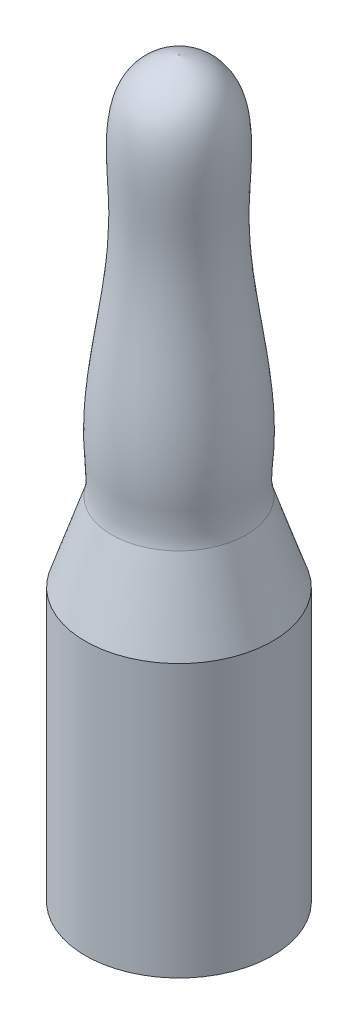
ISO-10303-21;
HEADER;
FILE_DESCRIPTION(('STEP AP214'),'2;1');
FILE_NAME('part.step','',(''),(''),'','','');
FILE_SCHEMA(('AUTOMOTIVE_DESIGN { 1 0 10303 214 1 1 1 1 }'));
ENDSEC;
DATA;
#1=APPLICATION_CONTEXT('core data for automotive mechanical design processes');
#2=APPLICATION_PROTOCOL_DEFINITION('international standard','automotive_design',2000,#1);
#3=PRODUCT_CONTEXT('',#1,'mechanical');
#4=PRODUCT('Part','Part','',(#3));
#5=PRODUCT_RELATED_PRODUCT_CATEGORY('part','',(#4));
#6=PRODUCT_DEFINITION_FORMATION('','',#4);
#7=PRODUCT_DEFINITION_CONTEXT('part definition',#1,'design');
#8=PRODUCT_DEFINITION('design','',#6,#7);
#9=PRODUCT_DEFINITION_SHAPE('','',#8);
#10=(LENGTH_UNIT() NAMED_UNIT(*) SI_UNIT(.MILLI.,.METRE.));
#11=(NAMED_UNIT(*) PLANE_ANGLE_UNIT() SI_UNIT($,.RADIAN.));
#12=(NAMED_UNIT(*) SI_UNIT($,.STERADIAN.) SOLID_ANGLE_UNIT());
#13=UNCERTAINTY_MEASURE_WITH_UNIT(LENGTH_MEASURE(1.E-05),#10,'distance_accuracy_value','');
#14=(GEOMETRIC_REPRESENTATION_CONTEXT(3) GLOBAL_UNCERTAINTY_ASSIGNED_CONTEXT((#13)) GLOBAL_UNIT_ASSIGNED_CONTEXT((#10,
#11,#12)) REPRESENTATION_CONTEXT('',''));
#15=CARTESIAN_POINT('',(0.,0.,0.));
#16=DIRECTION('',(0.,0.,1.));
#17=DIRECTION('',(1.,0.,0.));
#18=AXIS2_PLACEMENT_3D('',#15,#16,#17);
#19=CARTESIAN_POINT('',(80.7324840764331,0.,0.));
#20=DIRECTION('',(0.,-1.,0.));
#21=DIRECTION('',(0.,0.,-1.));
#22=AXIS2_PLACEMENT_3D('',#19,#20,#21);
#23=PLANE('',#22);
#24=CARTESIAN_POINT('',(0.,0.,0.));
#25=DIRECTION('',(0.,-1.,0.));
#26=DIRECTION('',(0.,0.,-1.));
#27=AXIS2_PLACEMENT_3D('',#24,#25,#26);
#28=CIRCLE('',#27,80.7324840764331);
#29=CARTESIAN_POINT('',(0.,0.,-80.7324840764331));
#30=VERTEX_POINT('',#29);
#31=EDGE_CURVE('E11',#30,#30,#28,.T.);
#32=ORIENTED_EDGE('',*,*,#31,.T.);
#33=EDGE_LOOP('',(#32));
#34=FACE_BOUND('',#33,.T.);
#35=ADVANCED_FACE('F41',(#34),#23,.T.);
#36=CARTESIAN_POINT('',(0.,0.,0.));
#37=DIRECTION('',(0.,-1.,0.));
#38=DIRECTION('',(0.,0.,-1.));
#39=AXIS2_PLACEMENT_3D('',#36,#37,#38);
#40=CYLINDRICAL_SURFACE('',#39,80.7324840764331);
#41=CARTESIAN_POINT('',(0.,234.792716424721,0.));
#42=DIRECTION('',(0.,-1.,0.));
#43=DIRECTION('',(0.,0.,-1.));
#44=AXIS2_PLACEMENT_3D('',#41,#42,#43);
#45=CIRCLE('',#44,80.7324840764331);
#46=CARTESIAN_POINT('',(0.,234.792716424721,-80.7324840764331));
#47=VERTEX_POINT('',#46);
#48=EDGE_CURVE('E47',#47,#47,#45,.T.);
#49=ORIENTED_EDGE('',*,*,#48,.T.);
#50=EDGE_LOOP('',(#49));
#51=FACE_BOUND('',#50,.T.);
#52=ORIENTED_EDGE('',*,*,#31,.F.);
#53=EDGE_LOOP('',(#52));
#54=FACE_BOUND('',#53,.T.);
#55=ADVANCED_FACE('F70',(#51,#54),#40,.T.);
#56=CARTESIAN_POINT('',(0.,234.792716424721,0.));
#57=DIRECTION('',(0.,-1.,0.));
#58=DIRECTION('',(0.,0.,-1.));
#59=AXIS2_PLACEMENT_3D('',#56,#57,#58);
#60=CONICAL_SURFACE('',#59,80.7324840764331,0.322399657902766);
#61=CARTESIAN_POINT('',(0.,302.842898063737,0.));
#62=DIRECTION('',(0.,-1.,0.));
#63=DIRECTION('',(0.,0.,-1.));
#64=AXIS2_PLACEMENT_3D('',#61,#62,#63);
#65=CIRCLE('',#64,58.);
#66=CARTESIAN_POINT('',(0.,302.842898063737,-58.));
#67=VERTEX_POINT('',#66);
#68=EDGE_CURVE('E57',#67,#67,#65,.T.);
#69=ORIENTED_EDGE('',*,*,#68,.T.);
#70=EDGE_LOOP('',(#69));
#71=FACE_BOUND('',#70,.T.);
#72=ORIENTED_EDGE('',*,*,#48,.F.);
#73=EDGE_LOOP('',(#72));
#74=FACE_BOUND('',#73,.T.);
#75=ADVANCED_FACE('F53',(#71,#74),#60,.T.);
#76=CARTESIAN_POINT('',(58.,302.842898063737,0.));
#77=CARTESIAN_POINT('',(55.4659820640595,313.37244494847,0.));
#78=CARTESIAN_POINT('',(65.1281550722015,385.952190654829,0.));
#79=CARTESIAN_POINT('',(27.5268847988678,490.952023600428,0.));
#80=CARTESIAN_POINT('',(55.1503573257923,621.151087311963,0.));
#81=CARTESIAN_POINT('',(0.,632.,0.));
#82=B_SPLINE_CURVE_WITH_KNOTS('',3,(#76,#77,#78,#79,#80,#81),.UNSPECIFIED.,.F.,.F.,(4,1,1,4),
(0.,0.0920490730306303,0.616593783965489,1.),.UNSPECIFIED.);
#83=CARTESIAN_POINT('',(0.,0.,0.));
#84=DIRECTION('',(0.,-1.,0.));
#85=AXIS1_PLACEMENT('',#83,#84);
#86=SURFACE_OF_REVOLUTION('',#82,#85);
#87=CARTESIAN_POINT('',(0.,632.,0.));
#88=VERTEX_POINT('',#87);
#89=VERTEX_LOOP('',#88);
#90=FACE_BOUND('',#89,.T.);
#91=ORIENTED_EDGE('',*,*,#68,.F.);
#92=EDGE_LOOP('',(#91));
#93=FACE_BOUND('',#92,.T.);
#94=ADVANCED_FACE('F50',(#90,#93),#86,.F.);
#95=CLOSED_SHELL('',(#35,#55,#75,#94));
#96=MANIFOLD_SOLID_BREP('B2',#95);
#97=ADVANCED_BREP_SHAPE_REPRESENTATION('',(#18,#96),#14);
#98=SHAPE_DEFINITION_REPRESENTATION(#9,#97);
ENDSEC;
END-ISO-10303-21;
